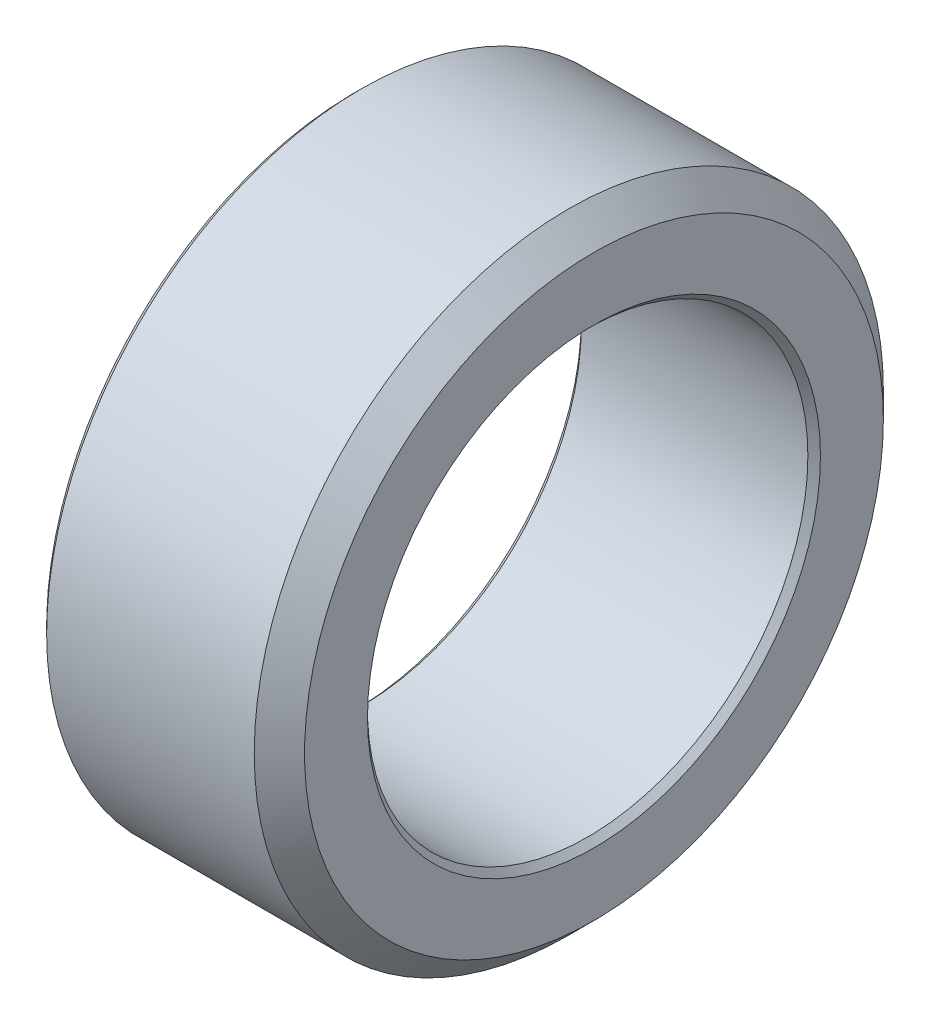
ISO-10303-21;
HEADER;
FILE_DESCRIPTION(('STEP AP214'),'2;1');
FILE_NAME('part.step','',(''),(''),'','','');
FILE_SCHEMA(('AUTOMOTIVE_DESIGN { 1 0 10303 214 1 1 1 1 }'));
ENDSEC;
DATA;
#1=APPLICATION_CONTEXT('core data for automotive mechanical design processes');
#2=APPLICATION_PROTOCOL_DEFINITION('international standard','automotive_design',2000,#1);
#3=PRODUCT_CONTEXT('',#1,'mechanical');
#4=PRODUCT('Part','Part','',(#3));
#5=PRODUCT_RELATED_PRODUCT_CATEGORY('part','',(#4));
#6=PRODUCT_DEFINITION_FORMATION('','',#4);
#7=PRODUCT_DEFINITION_CONTEXT('part definition',#1,'design');
#8=PRODUCT_DEFINITION('design','',#6,#7);
#9=PRODUCT_DEFINITION_SHAPE('','',#8);
#10=(LENGTH_UNIT() NAMED_UNIT(*) SI_UNIT(.MILLI.,.METRE.));
#11=(NAMED_UNIT(*) PLANE_ANGLE_UNIT() SI_UNIT($,.RADIAN.));
#12=(NAMED_UNIT(*) SI_UNIT($,.STERADIAN.) SOLID_ANGLE_UNIT());
#13=UNCERTAINTY_MEASURE_WITH_UNIT(LENGTH_MEASURE(1.E-05),#10,'distance_accuracy_value','');
#14=(GEOMETRIC_REPRESENTATION_CONTEXT(3) GLOBAL_UNCERTAINTY_ASSIGNED_CONTEXT((#13)) GLOBAL_UNIT_ASSIGNED_CONTEXT((#10,
#11,#12)) REPRESENTATION_CONTEXT('',''));
#15=CARTESIAN_POINT('',(0.,0.,0.));
#16=DIRECTION('',(0.,0.,1.));
#17=DIRECTION('',(1.,0.,0.));
#18=AXIS2_PLACEMENT_3D('',#15,#16,#17);
#19=CARTESIAN_POINT('',(38.,1.66533453693773E-13,-1.38777878078145E-13));
#20=DIRECTION('',(1.,0.,0.));
#21=DIRECTION('',(0.,0.,-1.));
#22=AXIS2_PLACEMENT_3D('',#19,#20,#21);
#23=PLANE('',#22);
#24=CARTESIAN_POINT('',(38.,1.66533453693773E-13,-1.38777878078145E-13));
#25=DIRECTION('',(1.,0.,0.));
#26=DIRECTION('',(0.,0.,-1.));
#27=AXIS2_PLACEMENT_3D('',#24,#25,#26);
#28=CIRCLE('',#27,46.);
#29=CARTESIAN_POINT('',(38.,5.77649039712469E-13,-46.0000000000002));
#30=VERTEX_POINT('',#29);
#31=EDGE_CURVE('E41',#30,#30,#28,.T.);
#32=ORIENTED_EDGE('',*,*,#31,.T.);
#33=EDGE_LOOP('',(#32));
#34=FACE_BOUND('',#33,.T.);
#35=CARTESIAN_POINT('',(38.,1.66533453693773E-13,-1.38777878078145E-13));
#36=DIRECTION('',(1.,0.,0.));
#37=DIRECTION('',(0.,0.,-1.));
#38=AXIS2_PLACEMENT_3D('',#35,#36,#37);
#39=CIRCLE('',#38,36.);
#40=CARTESIAN_POINT('',(38.,4.88276086230144E-13,-36.0000000000002));
#41=VERTEX_POINT('',#40);
#42=EDGE_CURVE('E45',#41,#41,#39,.F.);
#43=ORIENTED_EDGE('',*,*,#42,.T.);
#44=EDGE_LOOP('',(#43));
#45=FACE_BOUND('',#44,.T.);
#46=ADVANCED_FACE('F34',(#34,#45),#23,.T.);
#47=CARTESIAN_POINT('',(0.,0.,0.));
#48=DIRECTION('',(1.,0.,0.));
#49=DIRECTION('',(0.,0.,-1.));
#50=AXIS2_PLACEMENT_3D('',#47,#48,#49);
#51=PLANE('',#50);
#52=CARTESIAN_POINT('',(0.,0.,0.));
#53=DIRECTION('',(1.,0.,0.));
#54=DIRECTION('',(0.,0.,-1.));
#55=AXIS2_PLACEMENT_3D('',#52,#53,#54);
#56=CIRCLE('',#55,36.);
#57=CARTESIAN_POINT('',(0.,3.21742632536371E-13,-36.));
#58=VERTEX_POINT('',#57);
#59=EDGE_CURVE('E60',#58,#58,#56,.T.);
#60=ORIENTED_EDGE('',*,*,#59,.T.);
#61=EDGE_LOOP('',(#60));
#62=FACE_BOUND('',#61,.T.);
#63=CARTESIAN_POINT('',(0.,0.,0.));
#64=DIRECTION('',(1.,0.,0.));
#65=DIRECTION('',(0.,0.,-1.));
#66=AXIS2_PLACEMENT_3D('',#63,#64,#65);
#67=CIRCLE('',#66,49.);
#68=CARTESIAN_POINT('',(0.,4.37927472063393E-13,-49.));
#69=VERTEX_POINT('',#68);
#70=EDGE_CURVE('E63',#69,#69,#67,.F.);
#71=ORIENTED_EDGE('',*,*,#70,.T.);
#72=EDGE_LOOP('',(#71));
#73=FACE_BOUND('',#72,.T.);
#74=ADVANCED_FACE('F67',(#62,#73),#51,.F.);
#75=CARTESIAN_POINT('',(38.,1.66533453693773E-13,-1.38777878078145E-13));
#76=DIRECTION('',(-1.,0.,0.));
#77=DIRECTION('',(0.,0.,1.));
#78=AXIS2_PLACEMENT_3D('',#75,#76,#77);
#79=CYLINDRICAL_SURFACE('',#78,50.);
#80=CARTESIAN_POINT('',(34.,0.,-1.38777878078145E-13));
#81=DIRECTION('',(1.,0.,0.));
#82=DIRECTION('',(0.,0.,-1.));
#83=AXIS2_PLACEMENT_3D('',#80,#81,#82);
#84=CIRCLE('',#83,50.);
#85=CARTESIAN_POINT('',(34.,4.46864767411626E-13,-50.0000000000002));
#86=VERTEX_POINT('',#85);
#87=EDGE_CURVE('E10',#86,#86,#84,.F.);
#88=ORIENTED_EDGE('',*,*,#87,.T.);
#89=EDGE_LOOP('',(#88));
#90=FACE_BOUND('',#89,.T.);
#91=CARTESIAN_POINT('',(1.,0.,0.));
#92=DIRECTION('',(1.,0.,0.));
#93=DIRECTION('',(0.,0.,-1.));
#94=AXIS2_PLACEMENT_3D('',#91,#92,#93);
#95=CIRCLE('',#94,50.);
#96=CARTESIAN_POINT('',(0.999999999999974,4.46864767411626E-13,-50.));
#97=VERTEX_POINT('',#96);
#98=EDGE_CURVE('E49',#97,#97,#95,.T.);
#99=ORIENTED_EDGE('',*,*,#98,.T.);
#100=EDGE_LOOP('',(#99));
#101=FACE_BOUND('',#100,.T.);
#102=ADVANCED_FACE('F77',(#90,#101),#79,.T.);
#103=CARTESIAN_POINT('',(38.,1.66533453693773E-13,-1.38777878078145E-13));
#104=DIRECTION('',(-1.,0.,0.));
#105=DIRECTION('',(0.,0.,1.));
#106=AXIS2_PLACEMENT_3D('',#103,#104,#105);
#107=CYLINDRICAL_SURFACE('',#106,35.);
#108=CARTESIAN_POINT('',(1.,0.,0.));
#109=DIRECTION('',(1.,0.,0.));
#110=DIRECTION('',(0.,0.,-1.));
#111=AXIS2_PLACEMENT_3D('',#108,#109,#110);
#112=CIRCLE('',#111,35.);
#113=CARTESIAN_POINT('',(0.999999999999982,3.12805337188138E-13,-35.));
#114=VERTEX_POINT('',#113);
#115=EDGE_CURVE('E54',#114,#114,#112,.F.);
#116=ORIENTED_EDGE('',*,*,#115,.T.);
#117=EDGE_LOOP('',(#116));
#118=FACE_BOUND('',#117,.T.);
#119=CARTESIAN_POINT('',(37.0000000000001,1.66533453693773E-13,-1.38777878078145E-13));
#120=DIRECTION('',(1.,0.,0.));
#121=DIRECTION('',(0.,0.,-1.));
#122=AXIS2_PLACEMENT_3D('',#119,#120,#121);
#123=CIRCLE('',#122,35.);
#124=CARTESIAN_POINT('',(37.0000000000001,4.79338790881911E-13,-35.0000000000002));
#125=VERTEX_POINT('',#124);
#126=EDGE_CURVE('E57',#125,#125,#123,.T.);
#127=ORIENTED_EDGE('',*,*,#126,.T.);
#128=EDGE_LOOP('',(#127));
#129=FACE_BOUND('',#128,.T.);
#130=ADVANCED_FACE('F79',(#118,#129),#107,.F.);
#131=CARTESIAN_POINT('',(0.,0.,0.));
#132=DIRECTION('',(-1.,0.,0.));
#133=DIRECTION('',(0.,0.,1.));
#134=AXIS2_PLACEMENT_3D('',#131,#132,#133);
#135=CONICAL_SURFACE('',#134,36.,0.785398163397441);
#136=ORIENTED_EDGE('',*,*,#115,.F.);
#137=EDGE_LOOP('',(#136));
#138=FACE_BOUND('',#137,.T.);
#139=ORIENTED_EDGE('',*,*,#59,.F.);
#140=EDGE_LOOP('',(#139));
#141=FACE_BOUND('',#140,.T.);
#142=ADVANCED_FACE('F73',(#138,#141),#135,.F.);
#143=CARTESIAN_POINT('',(1.,0.,0.));
#144=DIRECTION('',(1.,0.,0.));
#145=DIRECTION('',(0.,0.,-1.));
#146=AXIS2_PLACEMENT_3D('',#143,#144,#145);
#147=CONICAL_SURFACE('',#146,50.,0.785398163397452);
#148=ORIENTED_EDGE('',*,*,#70,.F.);
#149=EDGE_LOOP('',(#148));
#150=FACE_BOUND('',#149,.T.);
#151=ORIENTED_EDGE('',*,*,#98,.F.);
#152=EDGE_LOOP('',(#151));
#153=FACE_BOUND('',#152,.T.);
#154=ADVANCED_FACE('F69',(#150,#153),#147,.T.);
#155=CARTESIAN_POINT('',(37.0000000000001,1.66533453693773E-13,-1.38777878078145E-13));
#156=DIRECTION('',(1.,0.,0.));
#157=DIRECTION('',(0.,0.,-1.));
#158=AXIS2_PLACEMENT_3D('',#155,#156,#157);
#159=CONICAL_SURFACE('',#158,35.,0.785398163397455);
#160=ORIENTED_EDGE('',*,*,#42,.F.);
#161=EDGE_LOOP('',(#160));
#162=FACE_BOUND('',#161,.T.);
#163=ORIENTED_EDGE('',*,*,#126,.F.);
#164=EDGE_LOOP('',(#163));
#165=FACE_BOUND('',#164,.T.);
#166=ADVANCED_FACE('F72',(#162,#165),#159,.F.);
#167=CARTESIAN_POINT('',(38.,1.66533453693773E-13,-1.38777878078145E-13));
#168=DIRECTION('',(-1.,0.,0.));
#169=DIRECTION('',(0.,0.,1.));
#170=AXIS2_PLACEMENT_3D('',#167,#168,#169);
#171=CONICAL_SURFACE('',#170,46.,0.785398163397447);
#172=ORIENTED_EDGE('',*,*,#87,.F.);
#173=EDGE_LOOP('',(#172));
#174=FACE_BOUND('',#173,.T.);
#175=ORIENTED_EDGE('',*,*,#31,.F.);
#176=EDGE_LOOP('',(#175));
#177=FACE_BOUND('',#176,.T.);
#178=ADVANCED_FACE('F36',(#174,#177),#171,.T.);
#179=CLOSED_SHELL('',(#46,#74,#102,#130,#142,#154,#166,#178));
#180=MANIFOLD_SOLID_BREP('B2',#179);
#181=ADVANCED_BREP_SHAPE_REPRESENTATION('',(#18,#180),#14);
#182=SHAPE_DEFINITION_REPRESENTATION(#9,#181);
ENDSEC;
END-ISO-10303-21;
